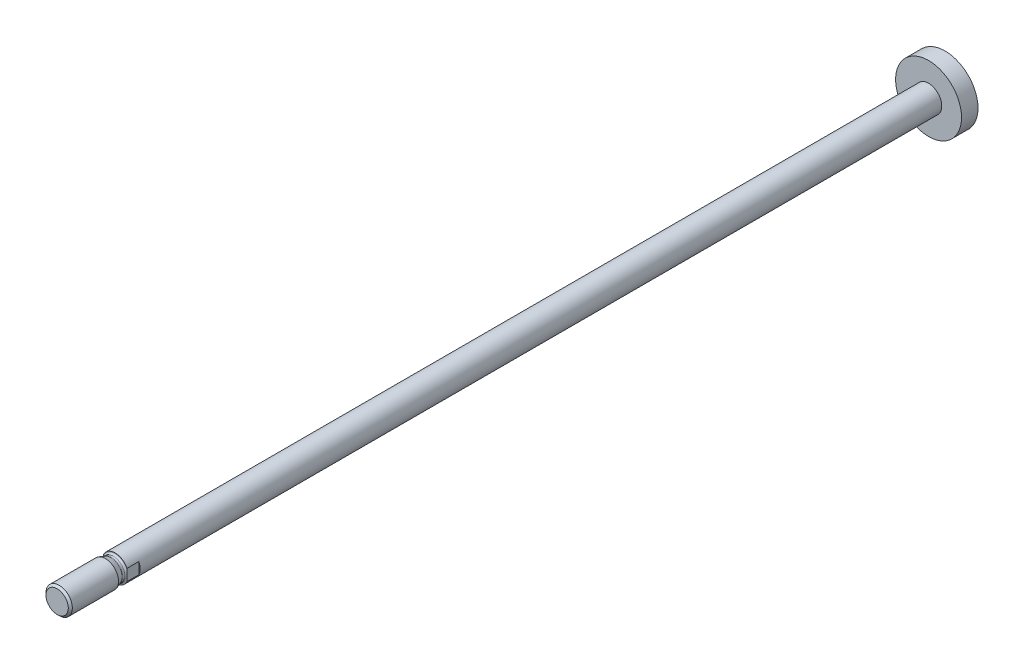
ISO-10303-21;
HEADER;
FILE_DESCRIPTION(('STEP AP214'),'2;1');
FILE_NAME('part.step','',(''),(''),'','','');
FILE_SCHEMA(('AUTOMOTIVE_DESIGN { 1 0 10303 214 1 1 1 1 }'));
ENDSEC;
DATA;
#1=APPLICATION_CONTEXT('core data for automotive mechanical design processes');
#2=APPLICATION_PROTOCOL_DEFINITION('international standard','automotive_design',2000,#1);
#3=PRODUCT_CONTEXT('',#1,'mechanical');
#4=PRODUCT('Part','Part','',(#3));
#5=PRODUCT_RELATED_PRODUCT_CATEGORY('part','',(#4));
#6=PRODUCT_DEFINITION_FORMATION('','',#4);
#7=PRODUCT_DEFINITION_CONTEXT('part definition',#1,'design');
#8=PRODUCT_DEFINITION('design','',#6,#7);
#9=PRODUCT_DEFINITION_SHAPE('','',#8);
#10=(LENGTH_UNIT() NAMED_UNIT(*) SI_UNIT(.MILLI.,.METRE.));
#11=(NAMED_UNIT(*) PLANE_ANGLE_UNIT() SI_UNIT($,.RADIAN.));
#12=(NAMED_UNIT(*) SI_UNIT($,.STERADIAN.) SOLID_ANGLE_UNIT());
#13=UNCERTAINTY_MEASURE_WITH_UNIT(LENGTH_MEASURE(1.E-05),#10,'distance_accuracy_value','');
#14=(GEOMETRIC_REPRESENTATION_CONTEXT(3) GLOBAL_UNCERTAINTY_ASSIGNED_CONTEXT((#13)) GLOBAL_UNIT_ASSIGNED_CONTEXT((#10,
#11,#12)) REPRESENTATION_CONTEXT('',''));
#15=CARTESIAN_POINT('',(0.,0.,0.));
#16=DIRECTION('',(0.,0.,1.));
#17=DIRECTION('',(1.,0.,0.));
#18=AXIS2_PLACEMENT_3D('',#15,#16,#17);
#19=CARTESIAN_POINT('',(0.,0.,6.));
#20=DIRECTION('',(0.,0.,-1.));
#21=DIRECTION('',(-1.,0.,0.));
#22=AXIS2_PLACEMENT_3D('',#19,#20,#21);
#23=PLANE('',#22);
#24=DIRECTION('',(0.,1.,0.));
#25=VECTOR('',#24,1.);
#26=CARTESIAN_POINT('',(-4.5,0.,6.));
#27=LINE('',#26,#25);
#28=CARTESIAN_POINT('',(-4.5,-2.17944947177034,6.00000000000001));
#29=VERTEX_POINT('',#28);
#30=CARTESIAN_POINT('',(-4.5,-1.67032930884929,6.));
#31=VERTEX_POINT('',#30);
#32=EDGE_CURVE('E55',#29,#31,#27,.T.);
#33=ORIENTED_EDGE('',*,*,#32,.F.);
#34=CARTESIAN_POINT('',(0.,0.,6.00000000000001));
#35=DIRECTION('',(0.,0.,1.));
#36=DIRECTION('',(1.,0.,0.));
#37=AXIS2_PLACEMENT_3D('',#34,#35,#36);
#38=CIRCLE('',#37,5.);
#39=CARTESIAN_POINT('',(4.5,-2.17944947177034,6.00000000000001));
#40=VERTEX_POINT('',#39);
#41=EDGE_CURVE('E148',#29,#40,#38,.T.);
#42=ORIENTED_EDGE('',*,*,#41,.T.);
#43=DIRECTION('',(0.,-1.,0.));
#44=VECTOR('',#43,1.);
#45=CARTESIAN_POINT('',(4.5,0.,6.));
#46=LINE('',#45,#44);
#47=CARTESIAN_POINT('',(4.5,-1.67032930884926,5.99999999999964));
#48=VERTEX_POINT('',#47);
#49=EDGE_CURVE('E102',#48,#40,#46,.T.);
#50=ORIENTED_EDGE('',*,*,#49,.F.);
#51=CARTESIAN_POINT('',(0.,0.,6.));
#52=DIRECTION('',(0.,0.,1.));
#53=DIRECTION('',(1.,0.,0.));
#54=AXIS2_PLACEMENT_3D('',#51,#52,#53);
#55=CIRCLE('',#54,4.8000000000001);
#56=EDGE_CURVE('E150',#31,#48,#55,.T.);
#57=ORIENTED_EDGE('',*,*,#56,.F.);
#58=EDGE_LOOP('',(#33,#42,#50,#57));
#59=FACE_BOUND('',#58,.T.);
#60=ADVANCED_FACE('F41',(#59),#23,.F.);
#61=CARTESIAN_POINT('',(-4.5,1.67032930884926,5.99999999999964));
#62=VERTEX_POINT('',#61);
#63=CARTESIAN_POINT('',(-4.5,2.17944947177034,6.00000000000001));
#64=VERTEX_POINT('',#63);
#65=EDGE_CURVE('E111',#62,#64,#27,.T.);
#66=ORIENTED_EDGE('',*,*,#65,.F.);
#67=CARTESIAN_POINT('',(4.5,1.67032930884929,6.));
#68=VERTEX_POINT('',#67);
#69=EDGE_CURVE('E151',#68,#62,#55,.T.);
#70=ORIENTED_EDGE('',*,*,#69,.F.);
#71=CARTESIAN_POINT('',(4.5,2.17944947177034,6.00000000000001));
#72=VERTEX_POINT('',#71);
#73=EDGE_CURVE('E63',#72,#68,#46,.T.);
#74=ORIENTED_EDGE('',*,*,#73,.F.);
#75=EDGE_CURVE('E110',#72,#64,#38,.T.);
#76=ORIENTED_EDGE('',*,*,#75,.T.);
#77=EDGE_LOOP('',(#66,#70,#74,#76));
#78=FACE_BOUND('',#77,.T.);
#79=ADVANCED_FACE('F207',(#78),#23,.F.);
#80=CARTESIAN_POINT('',(0.,0.,-308.85));
#81=DIRECTION('',(0.,0.,1.));
#82=DIRECTION('',(1.,0.,0.));
#83=AXIS2_PLACEMENT_3D('',#80,#81,#82);
#84=CYLINDRICAL_SURFACE('',#83,5.);
#85=CARTESIAN_POINT('',(0.,0.,-302.6));
#86=DIRECTION('',(0.,0.,1.));
#87=DIRECTION('',(1.,0.,0.));
#88=AXIS2_PLACEMENT_3D('',#85,#86,#87);
#89=CIRCLE('',#88,5.);
#90=CARTESIAN_POINT('',(5.,0.,-302.6));
#91=VERTEX_POINT('',#90);
#92=EDGE_CURVE('E145',#91,#91,#89,.T.);
#93=ORIENTED_EDGE('',*,*,#92,.T.);
#94=EDGE_LOOP('',(#93));
#95=FACE_BOUND('',#94,.T.);
#96=DIRECTION('',(0.,0.,1.));
#97=VECTOR('',#96,1.);
#98=CARTESIAN_POINT('',(-4.5,-2.17944947177034,-308.85));
#99=LINE('',#98,#97);
#100=CARTESIAN_POINT('',(-4.5,-2.17944947177034,1.5));
#101=VERTEX_POINT('',#100);
#102=EDGE_CURVE('E119',#101,#29,#99,.T.);
#103=ORIENTED_EDGE('',*,*,#102,.F.);
#104=CARTESIAN_POINT('',(0.,0.,1.5));
#105=DIRECTION('',(0.,0.,1.));
#106=DIRECTION('',(1.,0.,0.));
#107=AXIS2_PLACEMENT_3D('',#104,#105,#106);
#108=CIRCLE('',#107,5.);
#109=CARTESIAN_POINT('',(-4.5,2.17944947177034,1.5));
#110=VERTEX_POINT('',#109);
#111=EDGE_CURVE('E11',#110,#101,#108,.T.);
#112=ORIENTED_EDGE('',*,*,#111,.F.);
#113=DIRECTION('',(0.,0.,1.));
#114=VECTOR('',#113,1.);
#115=CARTESIAN_POINT('',(-4.5,2.17944947177034,-308.85));
#116=LINE('',#115,#114);
#117=EDGE_CURVE('E117',#64,#110,#116,.F.);
#118=ORIENTED_EDGE('',*,*,#117,.F.);
#119=ORIENTED_EDGE('',*,*,#75,.F.);
#120=DIRECTION('',(0.,0.,1.));
#121=VECTOR('',#120,1.);
#122=CARTESIAN_POINT('',(4.5,2.17944947177034,-308.85));
#123=LINE('',#122,#121);
#124=CARTESIAN_POINT('',(4.5,2.17944947177034,1.5));
#125=VERTEX_POINT('',#124);
#126=EDGE_CURVE('E100',#125,#72,#123,.T.);
#127=ORIENTED_EDGE('',*,*,#126,.F.);
#128=CARTESIAN_POINT('',(4.5,-2.17944947177034,1.5));
#129=VERTEX_POINT('',#128);
#130=EDGE_CURVE('E44',#129,#125,#108,.T.);
#131=ORIENTED_EDGE('',*,*,#130,.F.);
#132=DIRECTION('',(0.,0.,1.));
#133=VECTOR('',#132,1.);
#134=CARTESIAN_POINT('',(4.5,-2.17944947177034,-308.85));
#135=LINE('',#134,#133);
#136=EDGE_CURVE('E101',#40,#129,#135,.F.);
#137=ORIENTED_EDGE('',*,*,#136,.F.);
#138=ORIENTED_EDGE('',*,*,#41,.F.);
#139=EDGE_LOOP('',(#103,#112,#118,#119,#127,#131,#137,#138));
#140=FACE_BOUND('',#139,.T.);
#141=ADVANCED_FACE('F107',(#95,#140),#84,.T.);
#142=CARTESIAN_POINT('',(0.,0.,6.6000000000001));
#143=DIRECTION('',(0.,0.,1.));
#144=DIRECTION('',(1.,0.,0.));
#145=AXIS2_PLACEMENT_3D('',#142,#143,#144);
#146=TOROIDAL_SURFACE('',#145,4.8000000000001,0.600000000000097);
#147=CARTESIAN_POINT('',(0.,0.,6.6));
#148=DIRECTION('',(0.,0.,1.));
#149=DIRECTION('',(1.,0.,0.));
#150=AXIS2_PLACEMENT_3D('',#147,#148,#149);
#151=CIRCLE('',#150,4.2);
#152=CARTESIAN_POINT('',(4.2,0.,6.6));
#153=VERTEX_POINT('',#152);
#154=EDGE_CURVE('E136',#153,#153,#151,.T.);
#155=ORIENTED_EDGE('',*,*,#154,.F.);
#156=EDGE_LOOP('',(#155));
#157=FACE_BOUND('',#156,.T.);
#158=CARTESIAN_POINT('',(-4.5,0.,6.08038475772938));
#159=CARTESIAN_POINT('',(-4.5,0.0998067376764843,6.08037873066074));
#160=CARTESIAN_POINT('',(-4.5,0.199616272799417,6.07841991767971));
#161=CARTESIAN_POINT('',(-4.5,0.399124218962602,6.07111486101505));
#162=CARTESIAN_POINT('',(-4.5,0.498822593852194,6.0657677261318));
#163=CARTESIAN_POINT('',(-4.5,0.698741622507767,6.05307617315213));
#164=CARTESIAN_POINT('',(-4.5,0.798961381101574,6.0457188074819));
#165=CARTESIAN_POINT('',(-4.5,0.999428388252497,6.03096110271823));
#166=CARTESIAN_POINT('',(-4.5,1.09967563538733,6.0235607506722));
#167=CARTESIAN_POINT('',(-4.5,1.3016110629467,6.01081416538467));
#168=CARTESIAN_POINT('',(-4.5,1.40330123417861,6.00549549428931));
#169=CARTESIAN_POINT('',(-4.5,1.60677834274211,5.99955448543189));
#170=CARTESIAN_POINT('',(-4.5,1.70856516640856,5.99892893983888));
#171=CARTESIAN_POINT('',(-4.5,1.91089156421157,6.00529022688693));
#172=CARTESIAN_POINT('',(-4.5,2.01143241584337,6.01219244591137));
#173=CARTESIAN_POINT('',(-4.5,2.16105475707008,6.03106064313289));
#174=CARTESIAN_POINT('',(-4.5,2.21066681684127,6.03875363847474));
#175=CARTESIAN_POINT('',(-4.5,2.30920875497539,6.05763368849147));
#176=CARTESIAN_POINT('',(-4.5,2.35813908405672,6.06881830784301));
#177=CARTESIAN_POINT('',(-4.5,2.45129258214881,6.09452632536258));
#178=CARTESIAN_POINT('',(-4.5,2.49559809321058,6.10874531075254));
#179=CARTESIAN_POINT('',(-4.5,2.58269752158666,6.14182358984602));
#180=CARTESIAN_POINT('',(-4.5,2.62548470760037,6.16070115913153));
#181=CARTESIAN_POINT('',(-4.5,2.708771704774,6.20450151168286));
#182=CARTESIAN_POINT('',(-4.5,2.7492254368668,6.22951398112986));
#183=CARTESIAN_POINT('',(-4.5,2.8245886025167,6.28679682914211));
#184=CARTESIAN_POINT('',(-4.5,2.85953391357846,6.31901662605556));
#185=CARTESIAN_POINT('',(-4.5,2.90361083640121,6.37234972904509));
#186=CARTESIAN_POINT('',(-4.5,2.91659554231069,6.39027429027149));
#187=CARTESIAN_POINT('',(-4.5,2.93974058832693,6.42788720022357));
#188=CARTESIAN_POINT('',(-4.5,2.94990211335329,6.44757480437922));
#189=CARTESIAN_POINT('',(-4.5,2.96675958241278,6.48864437298186));
#190=CARTESIAN_POINT('',(-4.5,2.97341943638567,6.51004146018642));
#191=CARTESIAN_POINT('',(-4.5,2.98245791270468,6.55372202128066));
#192=CARTESIAN_POINT('',(-4.5,2.98484130218967,6.57600447984377));
#193=CARTESIAN_POINT('',(-4.5,2.98506053282126,6.61790531869471));
#194=CARTESIAN_POINT('',(-4.5,2.98340761486304,6.63752261821441));
#195=CARTESIAN_POINT('',(-4.5,2.97674509421289,6.67617607456343));
#196=CARTESIAN_POINT('',(-4.5,2.97173449743984,6.6952120575414));
#197=CARTESIAN_POINT('',(-4.5,2.95888564781516,6.73184320253794));
#198=CARTESIAN_POINT('',(-4.5,2.95110802141781,6.74946002141396));
#199=CARTESIAN_POINT('',(-4.5,2.93318626166465,6.7834289561956));
#200=CARTESIAN_POINT('',(-4.5,2.9230415253375,6.79978074844682));
#201=CARTESIAN_POINT('',(-4.5,2.89384468501091,6.84100748772974));
#202=CARTESIAN_POINT('',(-4.5,2.87320788143216,6.86476044928355));
#203=CARTESIAN_POINT('',(-4.5,2.82847619421112,6.90876991000349));
#204=CARTESIAN_POINT('',(-4.5,2.80437017771157,6.92901467162748));
#205=CARTESIAN_POINT('',(-4.5,2.73725469332988,6.9786229862522));
#206=CARTESIAN_POINT('',(-4.5,2.69223076475127,7.00523927036113));
#207=CARTESIAN_POINT('',(-4.5,2.59889783314091,7.05161749488126));
#208=CARTESIAN_POINT('',(-4.5,2.55058470947157,7.07137064103301));
#209=CARTESIAN_POINT('',(-4.5,2.45254575507272,7.10534880858189));
#210=CARTESIAN_POINT('',(-4.5,2.40283511990763,7.11961868503931));
#211=CARTESIAN_POINT('',(-4.5,2.30236556499697,7.14394174846778));
#212=CARTESIAN_POINT('',(-4.5,2.25160550461614,7.15399006350479));
#213=CARTESIAN_POINT('',(-4.5,2.14932910845115,7.17070819486747));
#214=CARTESIAN_POINT('',(-4.5,2.097810491898,7.17736364613804));
#215=CARTESIAN_POINT('',(-4.5,1.99454893701165,7.18787736691893));
#216=CARTESIAN_POINT('',(-4.5,1.94280625316185,7.19173824340202));
#217=CARTESIAN_POINT('',(-4.5,1.76963465418981,7.20091417499184));
#218=CARTESIAN_POINT('',(-4.5,1.64795335250754,7.20121716445481));
#219=CARTESIAN_POINT('',(-4.5,1.40473993568908,7.19490670898454));
#220=CARTESIAN_POINT('',(-4.5,1.28320824117427,7.18828396320795));
#221=CARTESIAN_POINT('',(-4.5,1.04004923255828,7.17231563103041));
#222=CARTESIAN_POINT('',(-4.5,0.918422381035732,7.16296359204275));
#223=CARTESIAN_POINT('',(-4.5,0.675162216086409,7.14536648513597));
#224=CARTESIAN_POINT('',(-4.5,0.553528961243309,7.13712068197018));
#225=CARTESIAN_POINT('',(-4.5,0.309531254649917,7.12487742633612));
#226=CARTESIAN_POINT('',(-4.5,0.187165819913507,7.12089702125178));
#227=CARTESIAN_POINT('',(-4.5,-0.0576260136229764,7.1188711150715));
#228=CARTESIAN_POINT('',(-4.5,-0.180052414605451,7.12082584439527));
#229=CARTESIAN_POINT('',(-4.5,-0.424689664494776,7.12986037925898));
#230=CARTESIAN_POINT('',(-4.5,-0.546900510702155,7.13694024853251));
#231=CARTESIAN_POINT('',(-4.5,-0.791163807552297,7.15343708959476));
#232=CARTESIAN_POINT('',(-4.5,-0.913216226261198,7.16285447562868));
#233=CARTESIAN_POINT('',(-4.5,-1.13754216677607,7.17890571514816));
#234=CARTESIAN_POINT('',(-4.5,-1.23979919195089,7.18574310750968));
#235=CARTESIAN_POINT('',(-4.5,-1.44455801915984,7.19605628308861));
#236=CARTESIAN_POINT('',(-4.5,-1.54705992400007,7.1995302378615));
#237=CARTESIAN_POINT('',(-4.5,-1.75146483914747,7.20038116690825));
#238=CARTESIAN_POINT('',(-4.5,-1.85336706889882,7.19780028707852));
#239=CARTESIAN_POINT('',(-4.5,-2.00565175722784,7.18686770203603));
#240=CARTESIAN_POINT('',(-4.5,-2.05628276458105,7.18205255328381));
#241=CARTESIAN_POINT('',(-4.5,-2.15717659421825,7.16951871362447));
#242=CARTESIAN_POINT('',(-4.5,-2.20743958707826,7.16180146783043));
#243=CARTESIAN_POINT('',(-4.5,-2.28957213203389,7.14616674992979));
#244=CARTESIAN_POINT('',(-4.5,-2.32164005179182,7.13929190900874));
#245=CARTESIAN_POINT('',(-4.5,-2.38537373262414,7.12382910737058));
#246=CARTESIAN_POINT('',(-4.5,-2.41703940005995,7.11524075527335));
#247=CARTESIAN_POINT('',(-4.5,-2.47977482389712,7.09609145753328));
#248=CARTESIAN_POINT('',(-4.5,-2.51084460251956,7.08553058560536));
#249=CARTESIAN_POINT('',(-4.5,-2.57210334525408,7.06212827888268));
#250=CARTESIAN_POINT('',(-4.5,-2.6022927946332,7.0492881292692));
#251=CARTESIAN_POINT('',(-4.5,-2.66558221016024,7.01895384344607));
#252=CARTESIAN_POINT('',(-4.5,-2.69849376976795,7.00105903073458));
#253=CARTESIAN_POINT('',(-4.5,-2.76174921773302,6.96115946169793));
#254=CARTESIAN_POINT('',(-4.5,-2.79209631989084,6.93915996380233));
#255=CARTESIAN_POINT('',(-4.5,-2.84141302820097,6.89665559850046));
#256=CARTESIAN_POINT('',(-4.5,-2.86129984579273,6.87722524149457));
#257=CARTESIAN_POINT('',(-4.5,-2.89785672391277,6.8355233653846));
#258=CARTESIAN_POINT('',(-4.5,-2.91453205990263,6.81325660734041));
#259=CARTESIAN_POINT('',(-4.5,-2.93987201752797,6.77175640031647));
#260=CARTESIAN_POINT('',(-4.5,-2.94949836759846,6.7531143094616));
#261=CARTESIAN_POINT('',(-4.5,-2.96557855433331,6.71450034894554));
#262=CARTESIAN_POINT('',(-4.5,-2.97203515487244,6.69452965508271));
#263=CARTESIAN_POINT('',(-4.5,-2.98127259888945,6.65358938291631));
#264=CARTESIAN_POINT('',(-4.5,-2.98402709496137,6.63261373368397));
#265=CARTESIAN_POINT('',(-4.5,-2.98549402202548,6.5905217722223));
#266=CARTESIAN_POINT('',(-4.5,-2.98420752398454,6.56940549874219));
#267=CARTESIAN_POINT('',(-4.5,-2.97807496487522,6.52999280261072));
#268=CARTESIAN_POINT('',(-4.5,-2.97361805206967,6.5116336149263));
#269=CARTESIAN_POINT('',(-4.5,-2.96191834816582,6.47583441641286));
#270=CARTESIAN_POINT('',(-4.5,-2.95467452714891,6.45839474811012));
#271=CARTESIAN_POINT('',(-4.5,-2.93457216876764,6.41818105233859));
#272=CARTESIAN_POINT('',(-4.5,-2.92062563899873,6.39595214139084));
#273=CARTESIAN_POINT('',(-4.5,-2.88935514164919,6.35401611982453));
#274=CARTESIAN_POINT('',(-4.5,-2.8720236529583,6.33431478984219));
#275=CARTESIAN_POINT('',(-4.5,-2.82503290035833,6.28751283069156));
#276=CARTESIAN_POINT('',(-4.5,-2.79373056698905,6.26207403715508));
#277=CARTESIAN_POINT('',(-4.5,-2.72769125075381,6.21619293089448));
#278=CARTESIAN_POINT('',(-4.5,-2.69294681030937,6.19576181546384));
#279=CARTESIAN_POINT('',(-4.5,-2.62462940824694,6.16075352289615));
#280=CARTESIAN_POINT('',(-4.5,-2.59123929314754,6.14581211330114));
#281=CARTESIAN_POINT('',(-4.5,-2.52328983133287,6.11882957544506));
#282=CARTESIAN_POINT('',(-4.5,-2.48872943653316,6.10679112981438));
#283=CARTESIAN_POINT('',(-4.5,-2.41880662026664,6.08517054590459));
#284=CARTESIAN_POINT('',(-4.5,-2.38344313889604,6.07559188702146));
#285=CARTESIAN_POINT('',(-4.5,-2.31224293996831,6.05855773562935));
#286=CARTESIAN_POINT('',(-4.5,-2.27640656151919,6.05110079993009));
#287=CARTESIAN_POINT('',(-4.5,-2.16480723915517,6.0307785973574));
#288=CARTESIAN_POINT('',(-4.5,-2.08848391630038,6.02098616115935));
#289=CARTESIAN_POINT('',(-4.5,-1.93529360231886,6.00719570952082));
#290=CARTESIAN_POINT('',(-4.5,-1.85842605923994,6.0032048149566));
#291=CARTESIAN_POINT('',(-4.5,-1.70429930814401,5.99943251502908));
#292=CARTESIAN_POINT('',(-4.5,-1.62703976289022,5.99966800277574));
#293=CARTESIAN_POINT('',(-4.5,-1.47257781131278,6.00308214682154));
#294=CARTESIAN_POINT('',(-4.5,-1.39537543023679,6.0062617185583));
#295=CARTESIAN_POINT('',(-4.5,-1.16283780279443,6.01854464880536));
#296=CARTESIAN_POINT('',(-4.5,-1.00766573353247,6.0303854324212));
#297=CARTESIAN_POINT('',(-4.5,-0.775047905736102,6.04745755016681));
#298=CARTESIAN_POINT('',(-4.5,-0.697616588951308,6.05302769829481));
#299=CARTESIAN_POINT('',(-4.5,-0.542684692223429,6.06307257652476));
#300=CARTESIAN_POINT('',(-4.5,-0.465184120366961,6.0675474210761));
#301=CARTESIAN_POINT('',(-4.5,-0.322984015763616,6.07408605688258));
#302=CARTESIAN_POINT('',(-4.5,-0.258297640774171,6.07642695447791));
#303=CARTESIAN_POINT('',(-4.5,-0.129074493107146,6.07957603824672));
#304=CARTESIAN_POINT('',(-4.5,-0.0645378313986,6.08038865500073));
#305=CARTESIAN_POINT('',(-4.5,0.,6.08038475772938));
#306=B_SPLINE_CURVE_WITH_KNOTS('',3,(#158,#159,#160,#161,#162,#163,#164,#165,#166,#167,#168,
#169,#170,#171,#172,#173,#174,#175,#176,#177,#178,#179,#180,#181,#182,#183,#184,#185,#186,#187,
#188,#189,#190,#191,#192,#193,#194,#195,#196,#197,#198,#199,#200,#201,#202,#203,#204,#205,#206,
#207,#208,#209,#210,#211,#212,#213,#214,#215,#216,#217,#218,#219,#220,#221,#222,#223,#224,#225,
#226,#227,#228,#229,#230,#231,#232,#233,#234,#235,#236,#237,#238,#239,#240,#241,#242,#243,#244,
#245,#246,#247,#248,#249,#250,#251,#252,#253,#254,#255,#256,#257,#258,#259,#260,#261,#262,#263,
#264,#265,#266,#267,#268,#269,#270,#271,#272,#273,#274,#275,#276,#277,#278,#279,#280,#281,#282,
#283,#284,#285,#286,#287,#288,#289,#290,#291,#292,#293,#294,#295,#296,#297,#298,#299,#300,#301,
#302,#303,#304,#305),.UNSPECIFIED.,.T.,.F.,(4,2,2,2,2,2,2,2,2,2,2,2,2,2,2,2,2,2,2,2,2,2,2,2,2,2,
2,2,2,2,2,2,2,2,2,2,2,2,2,2,2,2,2,2,2,2,2,2,2,2,2,2,2,2,2,2,2,2,2,2,2,2,2,2,2,2,2,2,2,2,2,2,2,
4),(0.,0.2994098141348,0.598898412026793,0.900363389970373,1.20192447826241,1.50735320280908,
1.81257314260134,2.11439737680963,2.26491759901501,2.41533307068,2.55473558197034,
2.69469391263366,2.83683494912431,2.97800809289031,3.04420873642002,3.11038155270318,
3.17722363582535,3.24399116111409,3.30274900336453,3.36152424926965,3.4190838743025,
3.47665817747352,3.57051166174347,3.66467333495767,3.82069752394767,3.97692090756113,
4.13183764823947,4.28693268422187,4.44267903462694,4.598279906144,4.96287650737647,
5.32796336933296,5.69392045928577,6.05963310224143,6.42680198779118,6.79398512811941,
7.16117283462598,7.52842565915926,7.83585950589185,8.1434603872773,8.44892650990403,
8.6014429535017,8.75388355115798,8.85223498802891,8.95060891495163,9.04897916628346,
9.14729412626638,9.25944677261991,9.37145671687506,9.45461643081231,9.53763835181273,
9.60034145289489,9.66298978223713,9.72608165177017,9.78915680175371,9.8455891262504,
9.90204232571399,9.98032625055131,10.0587861366062,10.1791154564982,10.2997114301861,
10.4092927110068,10.5189748711755,10.6288113338668,10.7385729065131,10.9690632532295,
11.199836268168,11.4315319017406,11.6632996032826,12.1301114361985,12.36300865042,
12.5958815185765,12.7900520739374,12.9836588439167),.UNSPECIFIED.);
#307=EDGE_CURVE('E98',#31,#62,#306,.T.);
#308=ORIENTED_EDGE('',*,*,#307,.F.);
#309=ORIENTED_EDGE('',*,*,#56,.T.);
#310=CARTESIAN_POINT('',(4.5,0.,6.08038475772938));
#311=CARTESIAN_POINT('',(4.5,-0.0998067376764843,6.08037873066074));
#312=CARTESIAN_POINT('',(4.5,-0.199616272799417,6.07841991767971));
#313=CARTESIAN_POINT('',(4.5,-0.399124218962602,6.07111486101505));
#314=CARTESIAN_POINT('',(4.5,-0.498822593852194,6.0657677261318));
#315=CARTESIAN_POINT('',(4.5,-0.698741622507767,6.05307617315213));
#316=CARTESIAN_POINT('',(4.5,-0.798961381101574,6.0457188074819));
#317=CARTESIAN_POINT('',(4.5,-0.999428388252497,6.03096110271823));
#318=CARTESIAN_POINT('',(4.5,-1.09967563538733,6.0235607506722));
#319=CARTESIAN_POINT('',(4.5,-1.3016110629467,6.01081416538467));
#320=CARTESIAN_POINT('',(4.5,-1.40330123417861,6.00549549428931));
#321=CARTESIAN_POINT('',(4.5,-1.60677834274211,5.99955448543189));
#322=CARTESIAN_POINT('',(4.5,-1.70856516640856,5.99892893983888));
#323=CARTESIAN_POINT('',(4.5,-1.91089156421157,6.00529022688693));
#324=CARTESIAN_POINT('',(4.5,-2.01143241584337,6.01219244591137));
#325=CARTESIAN_POINT('',(4.5,-2.16105475707008,6.03106064313289));
#326=CARTESIAN_POINT('',(4.5,-2.21066681684127,6.03875363847474));
#327=CARTESIAN_POINT('',(4.5,-2.30920875497539,6.05763368849147));
#328=CARTESIAN_POINT('',(4.5,-2.35813908405672,6.06881830784301));
#329=CARTESIAN_POINT('',(4.5,-2.45129258214881,6.09452632536258));
#330=CARTESIAN_POINT('',(4.5,-2.49559809321058,6.10874531075254));
#331=CARTESIAN_POINT('',(4.5,-2.58269752158666,6.14182358984602));
#332=CARTESIAN_POINT('',(4.5,-2.62548470760037,6.16070115913153));
#333=CARTESIAN_POINT('',(4.5,-2.708771704774,6.20450151168286));
#334=CARTESIAN_POINT('',(4.5,-2.7492254368668,6.22951398112986));
#335=CARTESIAN_POINT('',(4.5,-2.8245886025167,6.28679682914211));
#336=CARTESIAN_POINT('',(4.5,-2.85953391357846,6.31901662605556));
#337=CARTESIAN_POINT('',(4.5,-2.90361083640121,6.37234972904509));
#338=CARTESIAN_POINT('',(4.5,-2.91659554231069,6.39027429027149));
#339=CARTESIAN_POINT('',(4.5,-2.93974058832693,6.42788720022357));
#340=CARTESIAN_POINT('',(4.5,-2.94990211335329,6.44757480437922));
#341=CARTESIAN_POINT('',(4.5,-2.96675958241278,6.48864437298186));
#342=CARTESIAN_POINT('',(4.5,-2.97341943638567,6.51004146018642));
#343=CARTESIAN_POINT('',(4.5,-2.98245791270468,6.55372202128066));
#344=CARTESIAN_POINT('',(4.5,-2.98484130218967,6.57600447984377));
#345=CARTESIAN_POINT('',(4.5,-2.98506053282126,6.61790531869471));
#346=CARTESIAN_POINT('',(4.5,-2.98340761486304,6.63752261821441));
#347=CARTESIAN_POINT('',(4.5,-2.97674509421289,6.67617607456343));
#348=CARTESIAN_POINT('',(4.5,-2.97173449743984,6.6952120575414));
#349=CARTESIAN_POINT('',(4.5,-2.95888564781516,6.73184320253794));
#350=CARTESIAN_POINT('',(4.5,-2.95110802141781,6.74946002141396));
#351=CARTESIAN_POINT('',(4.5,-2.93318626166465,6.7834289561956));
#352=CARTESIAN_POINT('',(4.5,-2.9230415253375,6.79978074844682));
#353=CARTESIAN_POINT('',(4.5,-2.89384468501091,6.84100748772974));
#354=CARTESIAN_POINT('',(4.5,-2.87320788143216,6.86476044928355));
#355=CARTESIAN_POINT('',(4.5,-2.82847619421112,6.90876991000349));
#356=CARTESIAN_POINT('',(4.5,-2.80437017771157,6.92901467162748));
#357=CARTESIAN_POINT('',(4.5,-2.73725469332988,6.9786229862522));
#358=CARTESIAN_POINT('',(4.5,-2.69223076475127,7.00523927036113));
#359=CARTESIAN_POINT('',(4.5,-2.59889783314091,7.05161749488126));
#360=CARTESIAN_POINT('',(4.5,-2.55058470947157,7.07137064103301));
#361=CARTESIAN_POINT('',(4.5,-2.45254575507272,7.10534880858189));
#362=CARTESIAN_POINT('',(4.5,-2.40283511990763,7.11961868503931));
#363=CARTESIAN_POINT('',(4.5,-2.30236556499697,7.14394174846778));
#364=CARTESIAN_POINT('',(4.5,-2.25160550461614,7.15399006350479));
#365=CARTESIAN_POINT('',(4.5,-2.14932910845115,7.17070819486747));
#366=CARTESIAN_POINT('',(4.5,-2.097810491898,7.17736364613804));
#367=CARTESIAN_POINT('',(4.5,-1.99454893701165,7.18787736691893));
#368=CARTESIAN_POINT('',(4.5,-1.94280625316185,7.19173824340202));
#369=CARTESIAN_POINT('',(4.5,-1.76963465418981,7.20091417499184));
#370=CARTESIAN_POINT('',(4.5,-1.64795335250754,7.20121716445481));
#371=CARTESIAN_POINT('',(4.5,-1.40473993568908,7.19490670898454));
#372=CARTESIAN_POINT('',(4.5,-1.28320824117427,7.18828396320795));
#373=CARTESIAN_POINT('',(4.5,-1.04004923255828,7.17231563103041));
#374=CARTESIAN_POINT('',(4.5,-0.918422381035732,7.16296359204275));
#375=CARTESIAN_POINT('',(4.5,-0.675162216086409,7.14536648513597));
#376=CARTESIAN_POINT('',(4.5,-0.553528961243309,7.13712068197018));
#377=CARTESIAN_POINT('',(4.5,-0.309531254649917,7.12487742633612));
#378=CARTESIAN_POINT('',(4.5,-0.187165819913507,7.12089702125178));
#379=CARTESIAN_POINT('',(4.5,0.0576260136229764,7.1188711150715));
#380=CARTESIAN_POINT('',(4.5,0.180052414605451,7.12082584439527));
#381=CARTESIAN_POINT('',(4.5,0.424689664494776,7.12986037925898));
#382=CARTESIAN_POINT('',(4.5,0.546900510702155,7.13694024853251));
#383=CARTESIAN_POINT('',(4.5,0.791163807552297,7.15343708959476));
#384=CARTESIAN_POINT('',(4.5,0.913216226261198,7.16285447562868));
#385=CARTESIAN_POINT('',(4.5,1.13754216677607,7.17890571514816));
#386=CARTESIAN_POINT('',(4.5,1.23979919195089,7.18574310750968));
#387=CARTESIAN_POINT('',(4.5,1.44455801915984,7.19605628308861));
#388=CARTESIAN_POINT('',(4.5,1.54705992400007,7.1995302378615));
#389=CARTESIAN_POINT('',(4.5,1.75146483914747,7.20038116690825));
#390=CARTESIAN_POINT('',(4.5,1.85336706889882,7.19780028707852));
#391=CARTESIAN_POINT('',(4.5,2.00565175722784,7.18686770203603));
#392=CARTESIAN_POINT('',(4.5,2.05628276458105,7.18205255328381));
#393=CARTESIAN_POINT('',(4.5,2.15717659421825,7.16951871362447));
#394=CARTESIAN_POINT('',(4.5,2.20743958707826,7.16180146783043));
#395=CARTESIAN_POINT('',(4.5,2.28957213203389,7.14616674992979));
#396=CARTESIAN_POINT('',(4.5,2.32164005179182,7.13929190900874));
#397=CARTESIAN_POINT('',(4.5,2.38537373262414,7.12382910737058));
#398=CARTESIAN_POINT('',(4.5,2.41703940005995,7.11524075527335));
#399=CARTESIAN_POINT('',(4.5,2.47977482389712,7.09609145753328));
#400=CARTESIAN_POINT('',(4.5,2.51084460251956,7.08553058560536));
#401=CARTESIAN_POINT('',(4.5,2.57210334525408,7.06212827888268));
#402=CARTESIAN_POINT('',(4.5,2.6022927946332,7.0492881292692));
#403=CARTESIAN_POINT('',(4.5,2.66558221016024,7.01895384344607));
#404=CARTESIAN_POINT('',(4.5,2.69849376976795,7.00105903073458));
#405=CARTESIAN_POINT('',(4.5,2.76174921773302,6.96115946169793));
#406=CARTESIAN_POINT('',(4.5,2.79209631989084,6.93915996380233));
#407=CARTESIAN_POINT('',(4.5,2.84141302820097,6.89665559850046));
#408=CARTESIAN_POINT('',(4.5,2.86129984579273,6.87722524149457));
#409=CARTESIAN_POINT('',(4.5,2.89785672391277,6.8355233653846));
#410=CARTESIAN_POINT('',(4.5,2.91453205990263,6.81325660734041));
#411=CARTESIAN_POINT('',(4.5,2.93987201752797,6.77175640031647));
#412=CARTESIAN_POINT('',(4.5,2.94949836759846,6.7531143094616));
#413=CARTESIAN_POINT('',(4.5,2.96557855433331,6.71450034894554));
#414=CARTESIAN_POINT('',(4.5,2.97203515487244,6.69452965508271));
#415=CARTESIAN_POINT('',(4.5,2.98127259888945,6.65358938291631));
#416=CARTESIAN_POINT('',(4.5,2.98402709496137,6.63261373368397));
#417=CARTESIAN_POINT('',(4.5,2.98549402202548,6.5905217722223));
#418=CARTESIAN_POINT('',(4.5,2.98420752398454,6.56940549874219));
#419=CARTESIAN_POINT('',(4.5,2.97807496487522,6.52999280261072));
#420=CARTESIAN_POINT('',(4.5,2.97361805206967,6.5116336149263));
#421=CARTESIAN_POINT('',(4.5,2.96191834816582,6.47583441641286));
#422=CARTESIAN_POINT('',(4.5,2.95467452714891,6.45839474811012));
#423=CARTESIAN_POINT('',(4.5,2.93457216876764,6.41818105233859));
#424=CARTESIAN_POINT('',(4.5,2.92062563899873,6.39595214139084));
#425=CARTESIAN_POINT('',(4.5,2.88935514164919,6.35401611982453));
#426=CARTESIAN_POINT('',(4.5,2.8720236529583,6.33431478984219));
#427=CARTESIAN_POINT('',(4.5,2.82503290035833,6.28751283069156));
#428=CARTESIAN_POINT('',(4.5,2.79373056698905,6.26207403715508));
#429=CARTESIAN_POINT('',(4.5,2.72769125075381,6.21619293089448));
#430=CARTESIAN_POINT('',(4.5,2.69294681030937,6.19576181546384));
#431=CARTESIAN_POINT('',(4.5,2.62462940824694,6.16075352289615));
#432=CARTESIAN_POINT('',(4.5,2.59123929314754,6.14581211330114));
#433=CARTESIAN_POINT('',(4.5,2.52328983133287,6.11882957544506));
#434=CARTESIAN_POINT('',(4.5,2.48872943653316,6.10679112981438));
#435=CARTESIAN_POINT('',(4.5,2.41880662026664,6.08517054590459));
#436=CARTESIAN_POINT('',(4.5,2.38344313889604,6.07559188702146));
#437=CARTESIAN_POINT('',(4.5,2.31224293996831,6.05855773562935));
#438=CARTESIAN_POINT('',(4.5,2.27640656151919,6.05110079993009));
#439=CARTESIAN_POINT('',(4.5,2.16480723915517,6.0307785973574));
#440=CARTESIAN_POINT('',(4.5,2.08848391630038,6.02098616115935));
#441=CARTESIAN_POINT('',(4.5,1.93529360231886,6.00719570952082));
#442=CARTESIAN_POINT('',(4.5,1.85842605923994,6.0032048149566));
#443=CARTESIAN_POINT('',(4.5,1.70429930814401,5.99943251502908));
#444=CARTESIAN_POINT('',(4.5,1.62703976289022,5.99966800277574));
#445=CARTESIAN_POINT('',(4.5,1.47257781131278,6.00308214682154));
#446=CARTESIAN_POINT('',(4.5,1.39537543023679,6.0062617185583));
#447=CARTESIAN_POINT('',(4.5,1.16283780279443,6.01854464880536));
#448=CARTESIAN_POINT('',(4.5,1.00766573353247,6.0303854324212));
#449=CARTESIAN_POINT('',(4.5,0.775047905736102,6.04745755016681));
#450=CARTESIAN_POINT('',(4.5,0.697616588951308,6.05302769829481));
#451=CARTESIAN_POINT('',(4.5,0.542684692223429,6.06307257652476));
#452=CARTESIAN_POINT('',(4.5,0.465184120366961,6.0675474210761));
#453=CARTESIAN_POINT('',(4.5,0.322984015763616,6.07408605688258));
#454=CARTESIAN_POINT('',(4.5,0.258297640774171,6.07642695447791));
#455=CARTESIAN_POINT('',(4.5,0.129074493107146,6.07957603824672));
#456=CARTESIAN_POINT('',(4.5,0.0645378313986,6.08038865500073));
#457=CARTESIAN_POINT('',(4.5,0.,6.08038475772938));
#458=B_SPLINE_CURVE_WITH_KNOTS('',3,(#310,#311,#312,#313,#314,#315,#316,#317,#318,#319,#320,
#321,#322,#323,#324,#325,#326,#327,#328,#329,#330,#331,#332,#333,#334,#335,#336,#337,#338,#339,
#340,#341,#342,#343,#344,#345,#346,#347,#348,#349,#350,#351,#352,#353,#354,#355,#356,#357,#358,
#359,#360,#361,#362,#363,#364,#365,#366,#367,#368,#369,#370,#371,#372,#373,#374,#375,#376,#377,
#378,#379,#380,#381,#382,#383,#384,#385,#386,#387,#388,#389,#390,#391,#392,#393,#394,#395,#396,
#397,#398,#399,#400,#401,#402,#403,#404,#405,#406,#407,#408,#409,#410,#411,#412,#413,#414,#415,
#416,#417,#418,#419,#420,#421,#422,#423,#424,#425,#426,#427,#428,#429,#430,#431,#432,#433,#434,
#435,#436,#437,#438,#439,#440,#441,#442,#443,#444,#445,#446,#447,#448,#449,#450,#451,#452,#453,
#454,#455,#456,#457),.UNSPECIFIED.,.T.,.F.,(4,2,2,2,2,2,2,2,2,2,2,2,2,2,2,2,2,2,2,2,2,2,2,2,2,2,
2,2,2,2,2,2,2,2,2,2,2,2,2,2,2,2,2,2,2,2,2,2,2,2,2,2,2,2,2,2,2,2,2,2,2,2,2,2,2,2,2,2,2,2,2,2,2,
4),(0.,0.2994098141348,0.598898412026793,0.900363389970373,1.20192447826241,1.50735320280908,
1.81257314260134,2.11439737680963,2.26491759901501,2.41533307068,2.55473558197034,
2.69469391263366,2.83683494912431,2.97800809289031,3.04420873642002,3.11038155270318,
3.17722363582535,3.24399116111409,3.30274900336453,3.36152424926965,3.4190838743025,
3.47665817747352,3.57051166174347,3.66467333495767,3.82069752394767,3.97692090756113,
4.13183764823947,4.28693268422187,4.44267903462694,4.598279906144,4.96287650737647,
5.32796336933296,5.69392045928577,6.05963310224143,6.42680198779118,6.79398512811941,
7.16117283462598,7.52842565915926,7.83585950589185,8.1434603872773,8.44892650990403,
8.6014429535017,8.75388355115798,8.85223498802891,8.95060891495163,9.04897916628346,
9.14729412626638,9.25944677261991,9.37145671687506,9.45461643081231,9.53763835181273,
9.60034145289489,9.66298978223713,9.72608165177017,9.78915680175371,9.8455891262504,
9.90204232571399,9.98032625055131,10.0587861366062,10.1791154564982,10.2997114301861,
10.4092927110068,10.5189748711755,10.6288113338668,10.7385729065131,10.9690632532295,
11.199836268168,11.4315319017406,11.6632996032826,12.1301114361985,12.36300865042,
12.5958815185765,12.7900520739374,12.9836588439167),.UNSPECIFIED.);
#459=EDGE_CURVE('E154',#68,#48,#458,.T.);
#460=ORIENTED_EDGE('',*,*,#459,.F.);
#461=ORIENTED_EDGE('',*,*,#69,.T.);
#462=EDGE_LOOP('',(#308,#309,#460,#461));
#463=FACE_BOUND('',#462,.T.);
#464=ADVANCED_FACE('F164',(#157,#463),#146,.F.);
#465=CARTESIAN_POINT('',(0.,5.,-302.6));
#466=DIRECTION('',(0.,0.,-1.));
#467=DIRECTION('',(-1.,0.,0.));
#468=AXIS2_PLACEMENT_3D('',#465,#466,#467);
#469=PLANE('',#468);
#470=ORIENTED_EDGE('',*,*,#92,.F.);
#471=EDGE_LOOP('',(#470));
#472=FACE_BOUND('',#471,.T.);
#473=CARTESIAN_POINT('',(0.,0.,-302.6));
#474=DIRECTION('',(0.,0.,1.));
#475=DIRECTION('',(1.,0.,0.));
#476=AXIS2_PLACEMENT_3D('',#473,#474,#475);
#477=CIRCLE('',#476,12.5);
#478=CARTESIAN_POINT('',(12.5,0.,-302.6));
#479=VERTEX_POINT('',#478);
#480=EDGE_CURVE('E142',#479,#479,#477,.T.);
#481=ORIENTED_EDGE('',*,*,#480,.T.);
#482=EDGE_LOOP('',(#481));
#483=FACE_BOUND('',#482,.T.);
#484=ADVANCED_FACE('F227',(#472,#483),#469,.F.);
#485=CARTESIAN_POINT('',(0.,0.,-308.85));
#486=DIRECTION('',(0.,0.,1.));
#487=DIRECTION('',(1.,0.,0.));
#488=AXIS2_PLACEMENT_3D('',#485,#486,#487);
#489=CYLINDRICAL_SURFACE('',#488,12.5);
#490=ORIENTED_EDGE('',*,*,#480,.F.);
#491=EDGE_LOOP('',(#490));
#492=FACE_BOUND('',#491,.T.);
#493=CARTESIAN_POINT('',(0.,0.,-308.85));
#494=DIRECTION('',(0.,0.,1.));
#495=DIRECTION('',(1.,0.,0.));
#496=AXIS2_PLACEMENT_3D('',#493,#494,#495);
#497=CIRCLE('',#496,12.5);
#498=CARTESIAN_POINT('',(12.5,0.,-308.85));
#499=VERTEX_POINT('',#498);
#500=EDGE_CURVE('E139',#499,#499,#497,.T.);
#501=ORIENTED_EDGE('',*,*,#500,.T.);
#502=EDGE_LOOP('',(#501));
#503=FACE_BOUND('',#502,.T.);
#504=ADVANCED_FACE('F202',(#492,#503),#489,.T.);
#505=CARTESIAN_POINT('',(0.,12.5,-308.85));
#506=DIRECTION('',(0.,0.,1.));
#507=DIRECTION('',(1.,0.,0.));
#508=AXIS2_PLACEMENT_3D('',#505,#506,#507);
#509=PLANE('',#508);
#510=ORIENTED_EDGE('',*,*,#500,.F.);
#511=EDGE_LOOP('',(#510));
#512=FACE_BOUND('',#511,.T.);
#513=ADVANCED_FACE('F197',(#512),#509,.F.);
#514=CARTESIAN_POINT('',(0.,0.,5.));
#515=DIRECTION('',(0.,0.,1.));
#516=DIRECTION('',(1.,0.,0.));
#517=AXIS2_PLACEMENT_3D('',#514,#515,#516);
#518=CYLINDRICAL_SURFACE('',#517,4.2);
#519=CARTESIAN_POINT('',(0.,0.,7.3942038115749));
#520=DIRECTION('',(0.,0.,1.));
#521=DIRECTION('',(1.,0.,0.));
#522=AXIS2_PLACEMENT_3D('',#519,#520,#521);
#523=CIRCLE('',#522,4.2);
#524=CARTESIAN_POINT('',(4.2,0.,7.3942038115749));
#525=VERTEX_POINT('',#524);
#526=EDGE_CURVE('E133',#525,#525,#523,.T.);
#527=ORIENTED_EDGE('',*,*,#526,.F.);
#528=EDGE_LOOP('',(#527));
#529=FACE_BOUND('',#528,.T.);
#530=ORIENTED_EDGE('',*,*,#154,.T.);
#531=EDGE_LOOP('',(#530));
#532=FACE_BOUND('',#531,.T.);
#533=ADVANCED_FACE('F194',(#529,#532),#518,.T.);
#534=CARTESIAN_POINT('',(0.,0.,7.39420381157482));
#535=DIRECTION('',(0.,0.,1.));
#536=DIRECTION('',(1.,0.,0.));
#537=AXIS2_PLACEMENT_3D('',#534,#535,#536);
#538=TOROIDAL_SURFACE('',#537,4.79999999999975,0.599999999999749);
#539=CARTESIAN_POINT('',(0.,0.,7.5994158975703));
#540=DIRECTION('',(0.,0.,1.));
#541=DIRECTION('',(1.,0.,0.));
#542=AXIS2_PLACEMENT_3D('',#539,#540,#541);
#543=CIRCLE('',#542,4.2361844275285);
#544=CARTESIAN_POINT('',(4.2361844275285,0.,7.5994158975703));
#545=VERTEX_POINT('',#544);
#546=EDGE_CURVE('E130',#545,#545,#543,.T.);
#547=ORIENTED_EDGE('',*,*,#546,.F.);
#548=EDGE_LOOP('',(#547));
#549=FACE_BOUND('',#548,.T.);
#550=ORIENTED_EDGE('',*,*,#526,.T.);
#551=EDGE_LOOP('',(#550));
#552=FACE_BOUND('',#551,.T.);
#553=ADVANCED_FACE('F191',(#549,#552),#538,.F.);
#554=CARTESIAN_POINT('',(0.,0.,7.5994158975703));
#555=DIRECTION('',(0.,0.,1.));
#556=DIRECTION('',(1.,0.,0.));
#557=AXIS2_PLACEMENT_3D('',#554,#555,#556);
#558=CONICAL_SURFACE('',#557,4.2361844275285,0.349065850398843);
#559=CARTESIAN_POINT('',(0.,0.,9.6979819355637));
#560=DIRECTION('',(0.,0.,1.));
#561=DIRECTION('',(1.,0.,0.));
#562=AXIS2_PLACEMENT_3D('',#559,#560,#561);
#563=CIRCLE('',#562,5.);
#564=CARTESIAN_POINT('',(5.,0.,9.6979819355637));
#565=VERTEX_POINT('',#564);
#566=EDGE_CURVE('E127',#565,#565,#563,.T.);
#567=ORIENTED_EDGE('',*,*,#566,.F.);
#568=EDGE_LOOP('',(#567));
#569=FACE_BOUND('',#568,.T.);
#570=ORIENTED_EDGE('',*,*,#546,.T.);
#571=EDGE_LOOP('',(#570));
#572=FACE_BOUND('',#571,.T.);
#573=ADVANCED_FACE('F187',(#569,#572),#558,.T.);
#574=CARTESIAN_POINT('',(0.,0.,5.));
#575=DIRECTION('',(0.,0.,1.));
#576=DIRECTION('',(1.,0.,0.));
#577=AXIS2_PLACEMENT_3D('',#574,#575,#576);
#578=CYLINDRICAL_SURFACE('',#577,5.);
#579=CARTESIAN_POINT('',(0.,0.,27.233));
#580=DIRECTION('',(0.,0.,1.));
#581=DIRECTION('',(1.,0.,0.));
#582=AXIS2_PLACEMENT_3D('',#579,#580,#581);
#583=CIRCLE('',#582,5.);
#584=CARTESIAN_POINT('',(5.,0.,27.233));
#585=VERTEX_POINT('',#584);
#586=EDGE_CURVE('E124',#585,#585,#583,.T.);
#587=ORIENTED_EDGE('',*,*,#586,.F.);
#588=EDGE_LOOP('',(#587));
#589=FACE_BOUND('',#588,.T.);
#590=ORIENTED_EDGE('',*,*,#566,.T.);
#591=EDGE_LOOP('',(#590));
#592=FACE_BOUND('',#591,.T.);
#593=ADVANCED_FACE('F183',(#589,#592),#578,.T.);
#594=CARTESIAN_POINT('',(0.,0.,27.233));
#595=DIRECTION('',(0.,0.,-1.));
#596=DIRECTION('',(-1.,0.,0.));
#597=AXIS2_PLACEMENT_3D('',#594,#595,#596);
#598=CONICAL_SURFACE('',#597,5.,0.785398163397448);
#599=CARTESIAN_POINT('',(0.,0.,28.));
#600=DIRECTION('',(0.,0.,1.));
#601=DIRECTION('',(1.,0.,0.));
#602=AXIS2_PLACEMENT_3D('',#599,#600,#601);
#603=CIRCLE('',#602,4.233);
#604=CARTESIAN_POINT('',(4.233,0.,28.));
#605=VERTEX_POINT('',#604);
#606=EDGE_CURVE('E121',#605,#605,#603,.T.);
#607=ORIENTED_EDGE('',*,*,#606,.F.);
#608=EDGE_LOOP('',(#607));
#609=FACE_BOUND('',#608,.T.);
#610=ORIENTED_EDGE('',*,*,#586,.T.);
#611=EDGE_LOOP('',(#610));
#612=FACE_BOUND('',#611,.T.);
#613=ADVANCED_FACE('F179',(#609,#612),#598,.T.);
#614=CARTESIAN_POINT('',(0.,0.,28.));
#615=DIRECTION('',(0.,0.,-1.));
#616=DIRECTION('',(-1.,0.,0.));
#617=AXIS2_PLACEMENT_3D('',#614,#615,#616);
#618=PLANE('',#617);
#619=ORIENTED_EDGE('',*,*,#606,.T.);
#620=EDGE_LOOP('',(#619));
#621=FACE_BOUND('',#620,.T.);
#622=ADVANCED_FACE('F171',(#621),#618,.F.);
#623=CARTESIAN_POINT('',(4.5,9.,7.));
#624=DIRECTION('',(1.,0.,0.));
#625=DIRECTION('',(0.,0.,-1.));
#626=AXIS2_PLACEMENT_3D('',#623,#624,#625);
#627=PLANE('',#626);
#628=ORIENTED_EDGE('',*,*,#126,.T.);
#629=ORIENTED_EDGE('',*,*,#73,.T.);
#630=ORIENTED_EDGE('',*,*,#459,.T.);
#631=ORIENTED_EDGE('',*,*,#49,.T.);
#632=ORIENTED_EDGE('',*,*,#136,.T.);
#633=DIRECTION('',(0.,-1.,0.));
#634=VECTOR('',#633,1.);
#635=CARTESIAN_POINT('',(4.5,9.,1.5));
#636=LINE('',#635,#634);
#637=EDGE_CURVE('E94',#125,#129,#636,.T.);
#638=ORIENTED_EDGE('',*,*,#637,.F.);
#639=EDGE_LOOP('',(#628,#629,#630,#631,#632,#638));
#640=FACE_BOUND('',#639,.T.);
#641=ADVANCED_FACE('F99',(#640),#627,.T.);
#642=CARTESIAN_POINT('',(0.,0.,1.5));
#643=DIRECTION('',(0.,0.,1.));
#644=DIRECTION('',(1.,0.,0.));
#645=AXIS2_PLACEMENT_3D('',#642,#643,#644);
#646=PLANE('',#645);
#647=ORIENTED_EDGE('',*,*,#130,.T.);
#648=ORIENTED_EDGE('',*,*,#637,.T.);
#649=EDGE_LOOP('',(#647,#648));
#650=FACE_BOUND('',#649,.T.);
#651=ADVANCED_FACE('F93',(#650),#646,.T.);
#652=ORIENTED_EDGE('',*,*,#111,.T.);
#653=DIRECTION('',(0.,1.,0.));
#654=VECTOR('',#653,1.);
#655=CARTESIAN_POINT('',(-4.5,-9.,1.5));
#656=LINE('',#655,#654);
#657=EDGE_CURVE('E103',#101,#110,#656,.T.);
#658=ORIENTED_EDGE('',*,*,#657,.T.);
#659=EDGE_LOOP('',(#652,#658));
#660=FACE_BOUND('',#659,.T.);
#661=ADVANCED_FACE('F172',(#660),#646,.T.);
#662=CARTESIAN_POINT('',(-4.5,-9.,7.));
#663=DIRECTION('',(-1.,0.,0.));
#664=DIRECTION('',(0.,0.,1.));
#665=AXIS2_PLACEMENT_3D('',#662,#663,#664);
#666=PLANE('',#665);
#667=ORIENTED_EDGE('',*,*,#102,.T.);
#668=ORIENTED_EDGE('',*,*,#32,.T.);
#669=ORIENTED_EDGE('',*,*,#307,.T.);
#670=ORIENTED_EDGE('',*,*,#65,.T.);
#671=ORIENTED_EDGE('',*,*,#117,.T.);
#672=ORIENTED_EDGE('',*,*,#657,.F.);
#673=EDGE_LOOP('',(#667,#668,#669,#670,#671,#672));
#674=FACE_BOUND('',#673,.T.);
#675=ADVANCED_FACE('F173',(#674),#666,.T.);
#676=CLOSED_SHELL('',(#60,#79,#141,#464,#484,#504,#513,#533,#553,#573,#593,#613,#622,#641,#651,
#661,#675));
#677=MANIFOLD_SOLID_BREP('B2',#676);
#678=ADVANCED_BREP_SHAPE_REPRESENTATION('',(#18,#677),#14);
#679=SHAPE_DEFINITION_REPRESENTATION(#9,#678);
ENDSEC;
END-ISO-10303-21;
